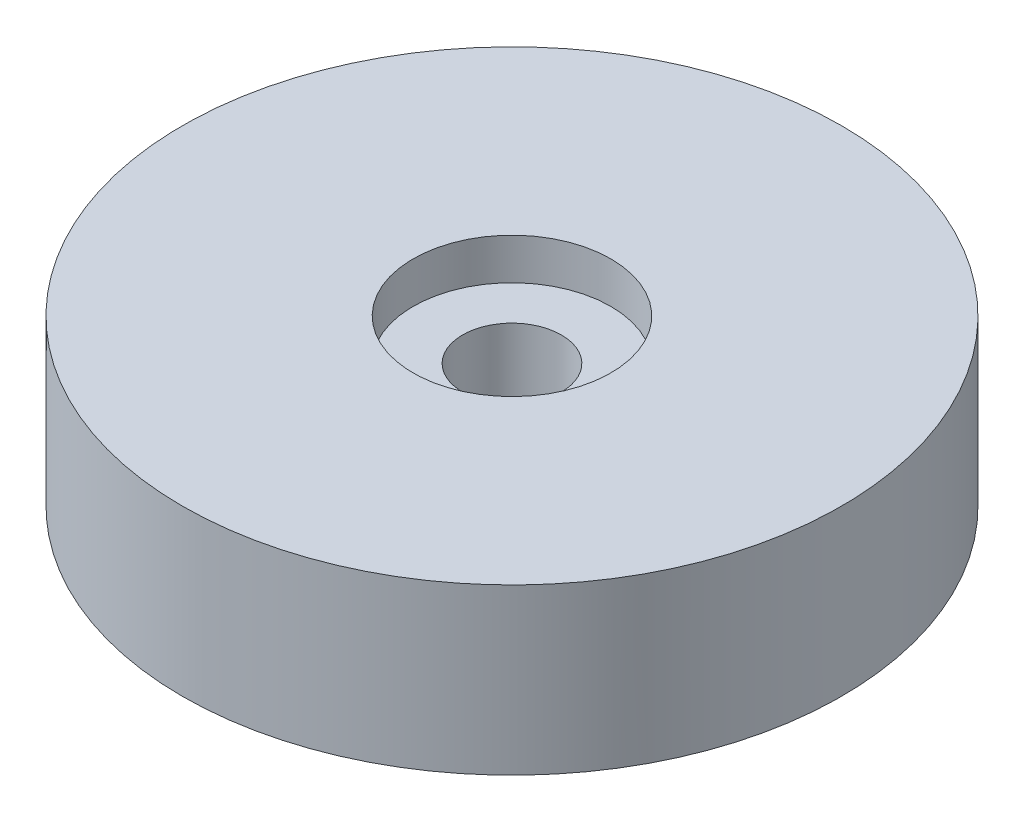
ISO-10303-21;
HEADER;
FILE_DESCRIPTION(('STEP AP214'),'2;1');
FILE_NAME('part.step','',(''),(''),'','','');
FILE_SCHEMA(('AUTOMOTIVE_DESIGN { 1 0 10303 214 1 1 1 1 }'));
ENDSEC;
DATA;
#1=APPLICATION_CONTEXT('core data for automotive mechanical design processes');
#2=APPLICATION_PROTOCOL_DEFINITION('international standard','automotive_design',2000,#1);
#3=PRODUCT_CONTEXT('',#1,'mechanical');
#4=PRODUCT('Part','Part','',(#3));
#5=PRODUCT_RELATED_PRODUCT_CATEGORY('part','',(#4));
#6=PRODUCT_DEFINITION_FORMATION('','',#4);
#7=PRODUCT_DEFINITION_CONTEXT('part definition',#1,'design');
#8=PRODUCT_DEFINITION('design','',#6,#7);
#9=PRODUCT_DEFINITION_SHAPE('','',#8);
#10=(LENGTH_UNIT() NAMED_UNIT(*) SI_UNIT(.MILLI.,.METRE.));
#11=(NAMED_UNIT(*) PLANE_ANGLE_UNIT() SI_UNIT($,.RADIAN.));
#12=(NAMED_UNIT(*) SI_UNIT($,.STERADIAN.) SOLID_ANGLE_UNIT());
#13=UNCERTAINTY_MEASURE_WITH_UNIT(LENGTH_MEASURE(1.E-05),#10,'distance_accuracy_value','');
#14=(GEOMETRIC_REPRESENTATION_CONTEXT(3) GLOBAL_UNCERTAINTY_ASSIGNED_CONTEXT((#13)) GLOBAL_UNIT_ASSIGNED_CONTEXT((#10,
#11,#12)) REPRESENTATION_CONTEXT('',''));
#15=CARTESIAN_POINT('',(0.,0.,0.));
#16=DIRECTION('',(0.,0.,1.));
#17=DIRECTION('',(1.,0.,0.));
#18=AXIS2_PLACEMENT_3D('',#15,#16,#17);
#19=CARTESIAN_POINT('',(0.,-3.75,0.));
#20=DIRECTION('',(0.,-1.,0.));
#21=DIRECTION('',(0.,0.,-1.));
#22=AXIS2_PLACEMENT_3D('',#19,#20,#21);
#23=CYLINDRICAL_SURFACE('',#22,3.);
#24=CARTESIAN_POINT('',(0.,-5.,0.));
#25=DIRECTION('',(0.,-1.,0.));
#26=DIRECTION('',(0.,0.,-1.));
#27=AXIS2_PLACEMENT_3D('',#24,#25,#26);
#28=CIRCLE('',#27,3.);
#29=CARTESIAN_POINT('',(0.,-5.,-3.));
#30=VERTEX_POINT('',#29);
#31=EDGE_CURVE('E47',#30,#30,#28,.F.);
#32=ORIENTED_EDGE('',*,*,#31,.T.);
#33=EDGE_LOOP('',(#32));
#34=FACE_BOUND('',#33,.T.);
#35=CARTESIAN_POINT('',(0.,-6.25,0.));
#36=DIRECTION('',(0.,-1.,0.));
#37=DIRECTION('',(0.,0.,-1.));
#38=AXIS2_PLACEMENT_3D('',#35,#36,#37);
#39=CIRCLE('',#38,3.);
#40=CARTESIAN_POINT('',(0.,-6.25,-3.));
#41=VERTEX_POINT('',#40);
#42=EDGE_CURVE('E38',#41,#41,#39,.T.);
#43=ORIENTED_EDGE('',*,*,#42,.T.);
#44=EDGE_LOOP('',(#43));
#45=FACE_BOUND('',#44,.T.);
#46=ADVANCED_FACE('F30',(#34,#45),#23,.F.);
#47=CARTESIAN_POINT('',(0.,-6.25,0.));
#48=DIRECTION('',(0.,-1.,0.));
#49=DIRECTION('',(0.,0.,-1.));
#50=AXIS2_PLACEMENT_3D('',#47,#48,#49);
#51=PLANE('',#50);
#52=CARTESIAN_POINT('',(0.,-6.25,0.));
#53=DIRECTION('',(0.,-1.,0.));
#54=DIRECTION('',(0.,0.,-1.));
#55=AXIS2_PLACEMENT_3D('',#52,#53,#54);
#56=CIRCLE('',#55,1.5);
#57=CARTESIAN_POINT('',(0.,-6.25,-1.5));
#58=VERTEX_POINT('',#57);
#59=EDGE_CURVE('E34',#58,#58,#56,.F.);
#60=ORIENTED_EDGE('',*,*,#59,.F.);
#61=EDGE_LOOP('',(#60));
#62=FACE_BOUND('',#61,.T.);
#63=ORIENTED_EDGE('',*,*,#42,.F.);
#64=EDGE_LOOP('',(#63));
#65=FACE_BOUND('',#64,.T.);
#66=ADVANCED_FACE('F64',(#62,#65),#51,.F.);
#67=CARTESIAN_POINT('',(0.,-10.,0.));
#68=DIRECTION('',(0.,1.,0.));
#69=DIRECTION('',(0.,0.,1.));
#70=AXIS2_PLACEMENT_3D('',#67,#68,#69);
#71=CYLINDRICAL_SURFACE('',#70,1.5);
#72=CARTESIAN_POINT('',(0.,-10.,0.));
#73=DIRECTION('',(0.,-1.,0.));
#74=DIRECTION('',(0.,0.,-1.));
#75=AXIS2_PLACEMENT_3D('',#72,#73,#74);
#76=CIRCLE('',#75,1.5);
#77=CARTESIAN_POINT('',(0.,-10.,-1.5));
#78=VERTEX_POINT('',#77);
#79=EDGE_CURVE('E44',#78,#78,#76,.T.);
#80=ORIENTED_EDGE('',*,*,#79,.T.);
#81=EDGE_LOOP('',(#80));
#82=FACE_BOUND('',#81,.T.);
#83=ORIENTED_EDGE('',*,*,#59,.T.);
#84=EDGE_LOOP('',(#83));
#85=FACE_BOUND('',#84,.T.);
#86=ADVANCED_FACE('F69',(#82,#85),#71,.F.);
#87=CARTESIAN_POINT('',(0.,-10.,0.));
#88=DIRECTION('',(0.,1.,0.));
#89=DIRECTION('',(0.,0.,1.));
#90=AXIS2_PLACEMENT_3D('',#87,#88,#89);
#91=CYLINDRICAL_SURFACE('',#90,10.);
#92=CARTESIAN_POINT('',(0.,-5.,0.));
#93=DIRECTION('',(0.,-1.,0.));
#94=DIRECTION('',(0.,0.,-1.));
#95=AXIS2_PLACEMENT_3D('',#92,#93,#94);
#96=CIRCLE('',#95,10.);
#97=CARTESIAN_POINT('',(0.,-5.,-10.));
#98=VERTEX_POINT('',#97);
#99=EDGE_CURVE('E50',#98,#98,#96,.T.);
#100=ORIENTED_EDGE('',*,*,#99,.T.);
#101=EDGE_LOOP('',(#100));
#102=FACE_BOUND('',#101,.T.);
#103=CARTESIAN_POINT('',(0.,-10.,0.));
#104=DIRECTION('',(0.,1.,0.));
#105=DIRECTION('',(0.,0.,1.));
#106=AXIS2_PLACEMENT_3D('',#103,#104,#105);
#107=CIRCLE('',#106,10.);
#108=CARTESIAN_POINT('',(0.,-10.,10.));
#109=VERTEX_POINT('',#108);
#110=EDGE_CURVE('E10',#109,#109,#107,.T.);
#111=ORIENTED_EDGE('',*,*,#110,.T.);
#112=EDGE_LOOP('',(#111));
#113=FACE_BOUND('',#112,.T.);
#114=ADVANCED_FACE('F32',(#102,#113),#91,.T.);
#115=CARTESIAN_POINT('',(0.,-10.,0.));
#116=DIRECTION('',(0.,1.,0.));
#117=DIRECTION('',(0.,0.,1.));
#118=AXIS2_PLACEMENT_3D('',#115,#116,#117);
#119=PLANE('',#118);
#120=ORIENTED_EDGE('',*,*,#79,.F.);
#121=EDGE_LOOP('',(#120));
#122=FACE_BOUND('',#121,.T.);
#123=ORIENTED_EDGE('',*,*,#110,.F.);
#124=EDGE_LOOP('',(#123));
#125=FACE_BOUND('',#124,.T.);
#126=ADVANCED_FACE('F58',(#122,#125),#119,.F.);
#127=CARTESIAN_POINT('',(0.,-5.,0.));
#128=DIRECTION('',(0.,-1.,0.));
#129=DIRECTION('',(0.,0.,-1.));
#130=AXIS2_PLACEMENT_3D('',#127,#128,#129);
#131=PLANE('',#130);
#132=ORIENTED_EDGE('',*,*,#99,.F.);
#133=EDGE_LOOP('',(#132));
#134=FACE_BOUND('',#133,.T.);
#135=ORIENTED_EDGE('',*,*,#31,.F.);
#136=EDGE_LOOP('',(#135));
#137=FACE_BOUND('',#136,.T.);
#138=ADVANCED_FACE('F55',(#134,#137),#131,.F.);
#139=CLOSED_SHELL('',(#46,#66,#86,#114,#126,#138));
#140=MANIFOLD_SOLID_BREP('B2',#139);
#141=ADVANCED_BREP_SHAPE_REPRESENTATION('',(#18,#140),#14);
#142=SHAPE_DEFINITION_REPRESENTATION(#9,#141);
ENDSEC;
END-ISO-10303-21;
